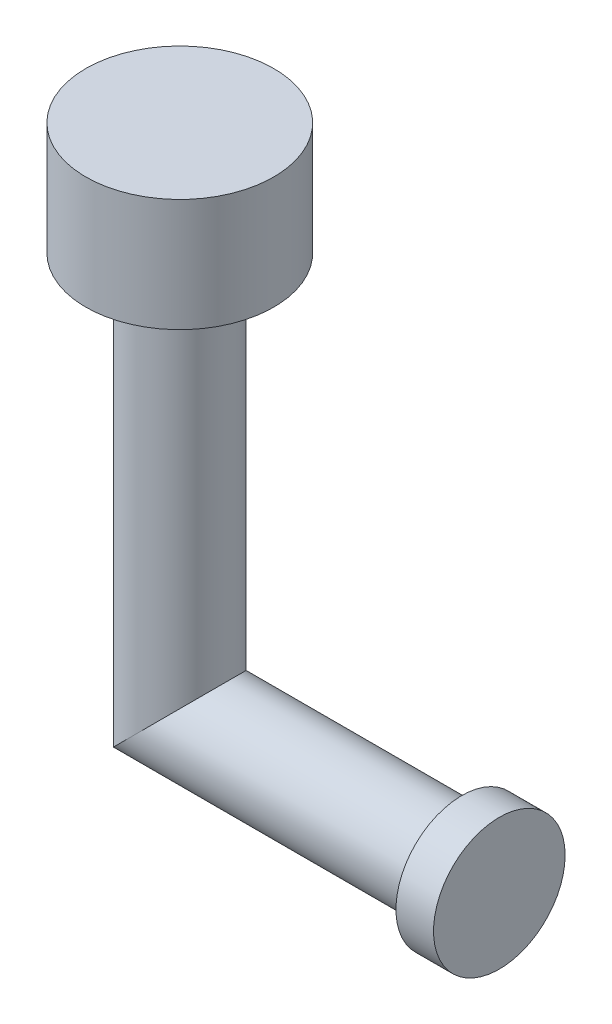
ISO-10303-21;
HEADER;
FILE_DESCRIPTION(('STEP AP214'),'2;1');
FILE_NAME('part.step','',(''),(''),'','','');
FILE_SCHEMA(('AUTOMOTIVE_DESIGN { 1 0 10303 214 1 1 1 1 }'));
ENDSEC;
DATA;
#1=APPLICATION_CONTEXT('core data for automotive mechanical design processes');
#2=APPLICATION_PROTOCOL_DEFINITION('international standard','automotive_design',2000,#1);
#3=PRODUCT_CONTEXT('',#1,'mechanical');
#4=PRODUCT('Part','Part','',(#3));
#5=PRODUCT_RELATED_PRODUCT_CATEGORY('part','',(#4));
#6=PRODUCT_DEFINITION_FORMATION('','',#4);
#7=PRODUCT_DEFINITION_CONTEXT('part definition',#1,'design');
#8=PRODUCT_DEFINITION('design','',#6,#7);
#9=PRODUCT_DEFINITION_SHAPE('','',#8);
#10=(LENGTH_UNIT() NAMED_UNIT(*) SI_UNIT(.MILLI.,.METRE.));
#11=(NAMED_UNIT(*) PLANE_ANGLE_UNIT() SI_UNIT($,.RADIAN.));
#12=(NAMED_UNIT(*) SI_UNIT($,.STERADIAN.) SOLID_ANGLE_UNIT());
#13=UNCERTAINTY_MEASURE_WITH_UNIT(LENGTH_MEASURE(1.E-05),#10,'distance_accuracy_value','');
#14=(GEOMETRIC_REPRESENTATION_CONTEXT(3) GLOBAL_UNCERTAINTY_ASSIGNED_CONTEXT((#13)) GLOBAL_UNIT_ASSIGNED_CONTEXT((#10,
#11,#12)) REPRESENTATION_CONTEXT('',''));
#15=CARTESIAN_POINT('',(0.,0.,0.));
#16=DIRECTION('',(0.,0.,1.));
#17=DIRECTION('',(1.,0.,0.));
#18=AXIS2_PLACEMENT_3D('',#15,#16,#17);
#19=CARTESIAN_POINT('',(-5.6,0.,0.));
#20=DIRECTION('',(1.,0.,0.));
#21=DIRECTION('',(0.,0.,-1.));
#22=AXIS2_PLACEMENT_3D('',#19,#20,#21);
#23=CYLINDRICAL_SURFACE('',#22,2.5);
#24=CARTESIAN_POINT('',(0.,0.,0.));
#25=DIRECTION('',(0.707106781186547,-0.707106781186547,0.));
#26=DIRECTION('',(-0.707106781186548,-0.707106781186548,0.));
#27=AXIS2_PLACEMENT_3D('',#24,#25,#26);
#28=ELLIPSE('',#27,3.53553390593274,2.5);
#29=CARTESIAN_POINT('',(-2.5,-2.5,0.));
#30=VERTEX_POINT('',#29);
#31=EDGE_CURVE('E10',#30,#30,#28,.F.);
#32=ORIENTED_EDGE('',*,*,#31,.F.);
#33=EDGE_LOOP('',(#32));
#34=FACE_BOUND('',#33,.T.);
#35=CARTESIAN_POINT('',(15.,0.,0.));
#36=DIRECTION('',(1.,0.,0.));
#37=DIRECTION('',(0.,0.,-1.));
#38=AXIS2_PLACEMENT_3D('',#35,#36,#37);
#39=CIRCLE('',#38,2.5);
#40=CARTESIAN_POINT('',(15.,0.,-2.5));
#41=VERTEX_POINT('',#40);
#42=EDGE_CURVE('E40',#41,#41,#39,.T.);
#43=ORIENTED_EDGE('',*,*,#42,.F.);
#44=EDGE_LOOP('',(#43));
#45=FACE_BOUND('',#44,.T.);
#46=ADVANCED_FACE('F37',(#34,#45),#23,.T.);
#47=CARTESIAN_POINT('',(0.,21.,0.));
#48=DIRECTION('',(0.,-1.,0.));
#49=DIRECTION('',(0.,0.,-1.));
#50=AXIS2_PLACEMENT_3D('',#47,#48,#49);
#51=CYLINDRICAL_SURFACE('',#50,2.5);
#52=CARTESIAN_POINT('',(0.,21.,0.));
#53=DIRECTION('',(0.,-1.,0.));
#54=DIRECTION('',(0.,0.,-1.));
#55=AXIS2_PLACEMENT_3D('',#52,#53,#54);
#56=CIRCLE('',#55,2.5);
#57=CARTESIAN_POINT('',(0.,21.,-2.5));
#58=VERTEX_POINT('',#57);
#59=EDGE_CURVE('E51',#58,#58,#56,.T.);
#60=ORIENTED_EDGE('',*,*,#59,.T.);
#61=EDGE_LOOP('',(#60));
#62=FACE_BOUND('',#61,.T.);
#63=ORIENTED_EDGE('',*,*,#31,.T.);
#64=EDGE_LOOP('',(#63));
#65=FACE_BOUND('',#64,.T.);
#66=ADVANCED_FACE('F89',(#62,#65),#51,.T.);
#67=CARTESIAN_POINT('',(17.,0.,0.));
#68=DIRECTION('',(-1.,0.,0.));
#69=DIRECTION('',(0.,0.,1.));
#70=AXIS2_PLACEMENT_3D('',#67,#68,#69);
#71=CYLINDRICAL_SURFACE('',#70,3.5);
#72=CARTESIAN_POINT('',(17.,0.,0.));
#73=DIRECTION('',(1.,0.,0.));
#74=DIRECTION('',(0.,0.,-1.));
#75=AXIS2_PLACEMENT_3D('',#72,#73,#74);
#76=CIRCLE('',#75,3.5);
#77=CARTESIAN_POINT('',(17.,0.,-3.5));
#78=VERTEX_POINT('',#77);
#79=EDGE_CURVE('E49',#78,#78,#76,.T.);
#80=ORIENTED_EDGE('',*,*,#79,.F.);
#81=EDGE_LOOP('',(#80));
#82=FACE_BOUND('',#81,.T.);
#83=CARTESIAN_POINT('',(15.,0.,0.));
#84=DIRECTION('',(1.,0.,0.));
#85=DIRECTION('',(0.,0.,-1.));
#86=AXIS2_PLACEMENT_3D('',#83,#84,#85);
#87=CIRCLE('',#86,3.5);
#88=CARTESIAN_POINT('',(15.,0.,-3.5));
#89=VERTEX_POINT('',#88);
#90=EDGE_CURVE('E55',#89,#89,#87,.T.);
#91=ORIENTED_EDGE('',*,*,#90,.T.);
#92=EDGE_LOOP('',(#91));
#93=FACE_BOUND('',#92,.T.);
#94=ADVANCED_FACE('F91',(#82,#93),#71,.T.);
#95=CARTESIAN_POINT('',(17.,0.,0.));
#96=DIRECTION('',(1.,0.,0.));
#97=DIRECTION('',(0.,0.,-1.));
#98=AXIS2_PLACEMENT_3D('',#95,#96,#97);
#99=PLANE('',#98);
#100=ORIENTED_EDGE('',*,*,#79,.T.);
#101=EDGE_LOOP('',(#100));
#102=FACE_BOUND('',#101,.T.);
#103=ADVANCED_FACE('F97',(#102),#99,.T.);
#104=CARTESIAN_POINT('',(15.,0.,0.));
#105=DIRECTION('',(1.,0.,0.));
#106=DIRECTION('',(0.,0.,-1.));
#107=AXIS2_PLACEMENT_3D('',#104,#105,#106);
#108=PLANE('',#107);
#109=ORIENTED_EDGE('',*,*,#42,.T.);
#110=EDGE_LOOP('',(#109));
#111=FACE_BOUND('',#110,.T.);
#112=ORIENTED_EDGE('',*,*,#90,.F.);
#113=EDGE_LOOP('',(#112));
#114=FACE_BOUND('',#113,.T.);
#115=ADVANCED_FACE('F76',(#111,#114),#108,.F.);
#116=CARTESIAN_POINT('',(0.,27.,0.));
#117=DIRECTION('',(0.,-1.,0.));
#118=DIRECTION('',(1.,0.,0.));
#119=AXIS2_PLACEMENT_3D('',#116,#117,#118);
#120=CYLINDRICAL_SURFACE('',#119,5.);
#121=CARTESIAN_POINT('',(0.,27.,0.));
#122=DIRECTION('',(0.,1.,0.));
#123=DIRECTION('',(-1.,0.,0.));
#124=AXIS2_PLACEMENT_3D('',#121,#122,#123);
#125=CIRCLE('',#124,5.);
#126=CARTESIAN_POINT('',(-5.,27.,0.));
#127=VERTEX_POINT('',#126);
#128=EDGE_CURVE('E56',#127,#127,#125,.T.);
#129=ORIENTED_EDGE('',*,*,#128,.F.);
#130=EDGE_LOOP('',(#129));
#131=FACE_BOUND('',#130,.T.);
#132=CARTESIAN_POINT('',(0.,21.,0.));
#133=DIRECTION('',(0.,1.,0.));
#134=DIRECTION('',(-1.,0.,0.));
#135=AXIS2_PLACEMENT_3D('',#132,#133,#134);
#136=CIRCLE('',#135,5.);
#137=CARTESIAN_POINT('',(-5.,21.,0.));
#138=VERTEX_POINT('',#137);
#139=EDGE_CURVE('E63',#138,#138,#136,.T.);
#140=ORIENTED_EDGE('',*,*,#139,.T.);
#141=EDGE_LOOP('',(#140));
#142=FACE_BOUND('',#141,.T.);
#143=ADVANCED_FACE('F73',(#131,#142),#120,.T.);
#144=CARTESIAN_POINT('',(0.,27.,0.));
#145=DIRECTION('',(0.,1.,0.));
#146=DIRECTION('',(-1.,0.,0.));
#147=AXIS2_PLACEMENT_3D('',#144,#145,#146);
#148=PLANE('',#147);
#149=ORIENTED_EDGE('',*,*,#128,.T.);
#150=EDGE_LOOP('',(#149));
#151=FACE_BOUND('',#150,.T.);
#152=ADVANCED_FACE('F71',(#151),#148,.T.);
#153=CARTESIAN_POINT('',(0.,21.,0.));
#154=DIRECTION('',(0.,1.,0.));
#155=DIRECTION('',(-1.,0.,0.));
#156=AXIS2_PLACEMENT_3D('',#153,#154,#155);
#157=PLANE('',#156);
#158=ORIENTED_EDGE('',*,*,#59,.F.);
#159=EDGE_LOOP('',(#158));
#160=FACE_BOUND('',#159,.T.);
#161=ORIENTED_EDGE('',*,*,#139,.F.);
#162=EDGE_LOOP('',(#161));
#163=FACE_BOUND('',#162,.T.);
#164=ADVANCED_FACE('F80',(#160,#163),#157,.F.);
#165=CLOSED_SHELL('',(#46,#66,#94,#103,#115,#143,#152,#164));
#166=MANIFOLD_SOLID_BREP('B2',#165);
#167=ADVANCED_BREP_SHAPE_REPRESENTATION('',(#18,#166),#14);
#168=SHAPE_DEFINITION_REPRESENTATION(#9,#167);
ENDSEC;
END-ISO-10303-21;
